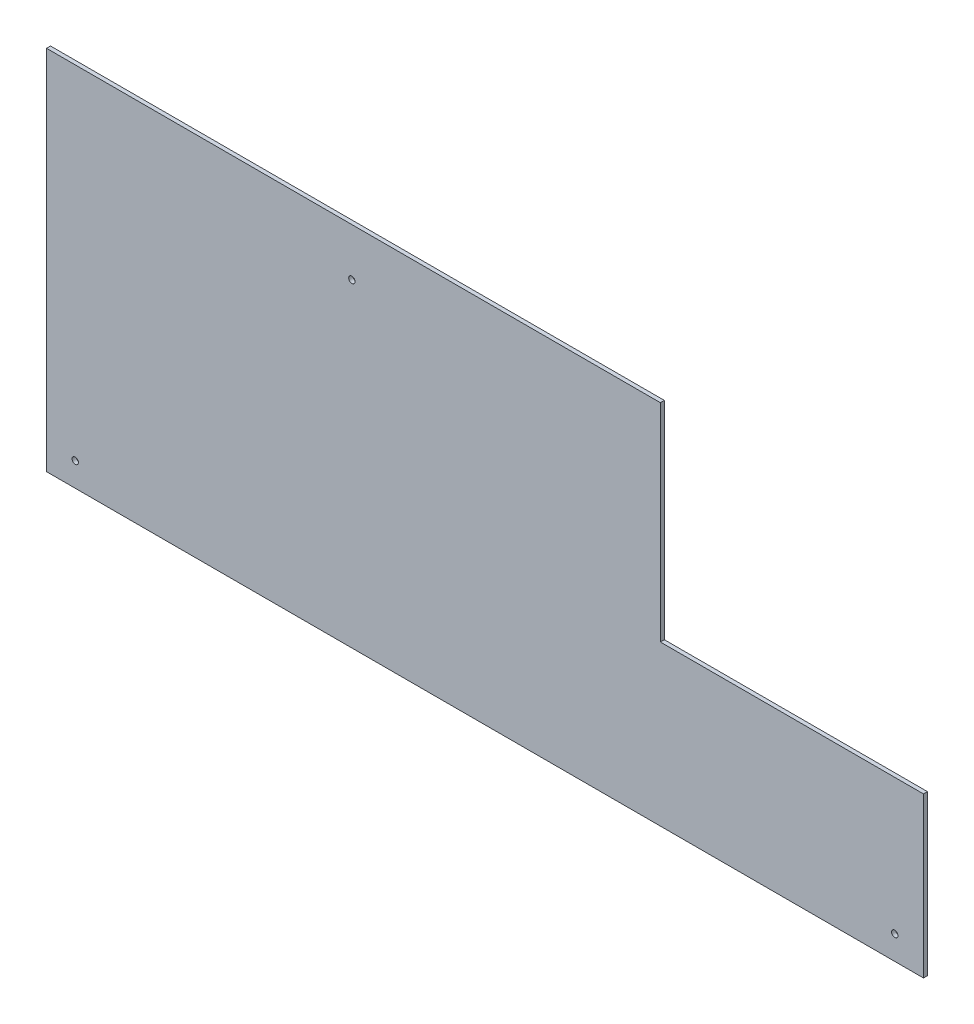
ISO-10303-21;
HEADER;
FILE_DESCRIPTION(('STEP AP214'),'2;1');
FILE_NAME('part.step','',(''),(''),'','','');
FILE_SCHEMA(('AUTOMOTIVE_DESIGN { 1 0 10303 214 1 1 1 1 }'));
ENDSEC;
DATA;
#1=APPLICATION_CONTEXT('core data for automotive mechanical design processes');
#2=APPLICATION_PROTOCOL_DEFINITION('international standard','automotive_design',2000,#1);
#3=PRODUCT_CONTEXT('',#1,'mechanical');
#4=PRODUCT('Part','Part','',(#3));
#5=PRODUCT_RELATED_PRODUCT_CATEGORY('part','',(#4));
#6=PRODUCT_DEFINITION_FORMATION('','',#4);
#7=PRODUCT_DEFINITION_CONTEXT('part definition',#1,'design');
#8=PRODUCT_DEFINITION('design','',#6,#7);
#9=PRODUCT_DEFINITION_SHAPE('','',#8);
#10=(LENGTH_UNIT() NAMED_UNIT(*) SI_UNIT(.MILLI.,.METRE.));
#11=(NAMED_UNIT(*) PLANE_ANGLE_UNIT() SI_UNIT($,.RADIAN.));
#12=(NAMED_UNIT(*) SI_UNIT($,.STERADIAN.) SOLID_ANGLE_UNIT());
#13=UNCERTAINTY_MEASURE_WITH_UNIT(LENGTH_MEASURE(1.E-05),#10,'distance_accuracy_value','');
#14=(GEOMETRIC_REPRESENTATION_CONTEXT(3) GLOBAL_UNCERTAINTY_ASSIGNED_CONTEXT((#13)) GLOBAL_UNIT_ASSIGNED_CONTEXT((#10,
#11,#12)) REPRESENTATION_CONTEXT('',''));
#15=CARTESIAN_POINT('',(0.,0.,0.));
#16=DIRECTION('',(0.,0.,1.));
#17=DIRECTION('',(1.,0.,0.));
#18=AXIS2_PLACEMENT_3D('',#15,#16,#17);
#19=CARTESIAN_POINT('',(275.,-115.,2.5));
#20=DIRECTION('',(-1.,0.,0.));
#21=DIRECTION('',(0.,0.,1.));
#22=AXIS2_PLACEMENT_3D('',#19,#20,#21);
#23=PLANE('',#22);
#24=DIRECTION('',(0.,1.,0.));
#25=VECTOR('',#24,1.);
#26=CARTESIAN_POINT('',(275.,-115.,0.));
#27=LINE('',#26,#25);
#28=CARTESIAN_POINT('',(275.,-115.,0.));
#29=VERTEX_POINT('',#28);
#30=CARTESIAN_POINT('',(275.,-15.,0.));
#31=VERTEX_POINT('',#30);
#32=EDGE_CURVE('E128',#29,#31,#27,.T.);
#33=ORIENTED_EDGE('',*,*,#32,.T.);
#34=DIRECTION('',(0.,0.,-1.));
#35=VECTOR('',#34,1.);
#36=CARTESIAN_POINT('',(275.,-15.,10.));
#37=LINE('',#36,#35);
#38=CARTESIAN_POINT('',(275.,-15.,2.5));
#39=VERTEX_POINT('',#38);
#40=EDGE_CURVE('E53',#39,#31,#37,.T.);
#41=ORIENTED_EDGE('',*,*,#40,.F.);
#42=DIRECTION('',(0.,1.,0.));
#43=VECTOR('',#42,1.);
#44=CARTESIAN_POINT('',(275.,-115.,2.5));
#45=LINE('',#44,#43);
#46=CARTESIAN_POINT('',(275.,-115.,2.5));
#47=VERTEX_POINT('',#46);
#48=EDGE_CURVE('E129',#47,#39,#45,.T.);
#49=ORIENTED_EDGE('',*,*,#48,.F.);
#50=DIRECTION('',(0.,0.,-1.));
#51=VECTOR('',#50,1.);
#52=CARTESIAN_POINT('',(275.,-115.,2.5));
#53=LINE('',#52,#51);
#54=EDGE_CURVE('E135',#47,#29,#53,.T.);
#55=ORIENTED_EDGE('',*,*,#54,.T.);
#56=EDGE_LOOP('',(#33,#41,#49,#55));
#57=FACE_BOUND('',#56,.T.);
#58=ADVANCED_FACE('F37',(#57),#23,.F.);
#59=CARTESIAN_POINT('',(275.,115.,2.5));
#60=DIRECTION('',(0.,-1.,0.));
#61=DIRECTION('',(1.,0.,0.));
#62=AXIS2_PLACEMENT_3D('',#59,#60,#61);
#63=PLANE('',#62);
#64=DIRECTION('',(-1.,0.,0.));
#65=VECTOR('',#64,1.);
#66=CARTESIAN_POINT('',(275.,115.,2.5));
#67=LINE('',#66,#65);
#68=CARTESIAN_POINT('',(110.,115.,2.5));
#69=VERTEX_POINT('',#68);
#70=CARTESIAN_POINT('',(-275.,115.,2.5));
#71=VERTEX_POINT('',#70);
#72=EDGE_CURVE('E84',#69,#71,#67,.T.);
#73=ORIENTED_EDGE('',*,*,#72,.F.);
#74=DIRECTION('',(0.,0.,-1.));
#75=VECTOR('',#74,1.);
#76=CARTESIAN_POINT('',(110.,115.,10.));
#77=LINE('',#76,#75);
#78=CARTESIAN_POINT('',(110.,115.,0.));
#79=VERTEX_POINT('',#78);
#80=EDGE_CURVE('E108',#69,#79,#77,.T.);
#81=ORIENTED_EDGE('',*,*,#80,.T.);
#82=DIRECTION('',(-1.,0.,0.));
#83=VECTOR('',#82,1.);
#84=CARTESIAN_POINT('',(275.,115.,0.));
#85=LINE('',#84,#83);
#86=CARTESIAN_POINT('',(-275.,115.,0.));
#87=VERTEX_POINT('',#86);
#88=EDGE_CURVE('E119',#79,#87,#85,.T.);
#89=ORIENTED_EDGE('',*,*,#88,.T.);
#90=DIRECTION('',(0.,0.,-1.));
#91=VECTOR('',#90,1.);
#92=CARTESIAN_POINT('',(-275.,115.,2.5));
#93=LINE('',#92,#91);
#94=EDGE_CURVE('E11',#71,#87,#93,.T.);
#95=ORIENTED_EDGE('',*,*,#94,.F.);
#96=EDGE_LOOP('',(#73,#81,#89,#95));
#97=FACE_BOUND('',#96,.T.);
#98=ADVANCED_FACE('F167',(#97),#63,.F.);
#99=CARTESIAN_POINT('',(-275.,-115.,2.5));
#100=DIRECTION('',(1.,0.,0.));
#101=DIRECTION('',(0.,0.,-1.));
#102=AXIS2_PLACEMENT_3D('',#99,#100,#101);
#103=PLANE('',#102);
#104=DIRECTION('',(0.,-1.,0.));
#105=VECTOR('',#104,1.);
#106=CARTESIAN_POINT('',(-275.,-115.,0.));
#107=LINE('',#106,#105);
#108=CARTESIAN_POINT('',(-275.,-115.,0.));
#109=VERTEX_POINT('',#108);
#110=EDGE_CURVE('E138',#87,#109,#107,.T.);
#111=ORIENTED_EDGE('',*,*,#110,.T.);
#112=DIRECTION('',(0.,0.,-1.));
#113=VECTOR('',#112,1.);
#114=CARTESIAN_POINT('',(-275.,-115.,2.5));
#115=LINE('',#114,#113);
#116=CARTESIAN_POINT('',(-275.,-115.,2.5));
#117=VERTEX_POINT('',#116);
#118=EDGE_CURVE('E45',#117,#109,#115,.T.);
#119=ORIENTED_EDGE('',*,*,#118,.F.);
#120=DIRECTION('',(0.,-1.,0.));
#121=VECTOR('',#120,1.);
#122=CARTESIAN_POINT('',(-275.,-115.,2.5));
#123=LINE('',#122,#121);
#124=EDGE_CURVE('E132',#71,#117,#123,.T.);
#125=ORIENTED_EDGE('',*,*,#124,.F.);
#126=ORIENTED_EDGE('',*,*,#94,.T.);
#127=EDGE_LOOP('',(#111,#119,#125,#126));
#128=FACE_BOUND('',#127,.T.);
#129=ADVANCED_FACE('F172',(#128),#103,.F.);
#130=CARTESIAN_POINT('',(275.,-115.,2.5));
#131=DIRECTION('',(0.,1.,0.));
#132=DIRECTION('',(-1.,0.,0.));
#133=AXIS2_PLACEMENT_3D('',#130,#131,#132);
#134=PLANE('',#133);
#135=DIRECTION('',(1.,0.,0.));
#136=VECTOR('',#135,1.);
#137=CARTESIAN_POINT('',(275.,-115.,0.));
#138=LINE('',#137,#136);
#139=EDGE_CURVE('E79',#109,#29,#138,.T.);
#140=ORIENTED_EDGE('',*,*,#139,.T.);
#141=ORIENTED_EDGE('',*,*,#54,.F.);
#142=DIRECTION('',(1.,0.,0.));
#143=VECTOR('',#142,1.);
#144=CARTESIAN_POINT('',(275.,-115.,2.5));
#145=LINE('',#144,#143);
#146=EDGE_CURVE('E62',#117,#47,#145,.T.);
#147=ORIENTED_EDGE('',*,*,#146,.F.);
#148=ORIENTED_EDGE('',*,*,#118,.T.);
#149=EDGE_LOOP('',(#140,#141,#147,#148));
#150=FACE_BOUND('',#149,.T.);
#151=ADVANCED_FACE('F178',(#150),#134,.F.);
#152=CARTESIAN_POINT('',(0.,0.,2.5));
#153=DIRECTION('',(0.,0.,1.));
#154=DIRECTION('',(1.,0.,0.));
#155=AXIS2_PLACEMENT_3D('',#152,#153,#154);
#156=PLANE('',#155);
#157=CARTESIAN_POINT('',(-83.5000000000001,84.9999999999999,2.5));
#158=DIRECTION('',(0.,0.,1.));
#159=DIRECTION('',(1.,0.,0.));
#160=AXIS2_PLACEMENT_3D('',#157,#158,#159);
#161=CIRCLE('',#160,2.);
#162=CARTESIAN_POINT('',(-81.5000000000001,84.9999999999999,2.5));
#163=VERTEX_POINT('',#162);
#164=EDGE_CURVE('E146',#163,#163,#161,.T.);
#165=ORIENTED_EDGE('',*,*,#164,.F.);
#166=EDGE_LOOP('',(#165));
#167=FACE_BOUND('',#166,.T.);
#168=CARTESIAN_POINT('',(-257.,-99.9999999999979,2.5));
#169=DIRECTION('',(0.,0.,1.));
#170=DIRECTION('',(1.,0.,0.));
#171=AXIS2_PLACEMENT_3D('',#168,#169,#170);
#172=CIRCLE('',#171,2.);
#173=CARTESIAN_POINT('',(-255.,-99.9999999999979,2.5));
#174=VERTEX_POINT('',#173);
#175=EDGE_CURVE('E289',#174,#174,#172,.T.);
#176=ORIENTED_EDGE('',*,*,#175,.F.);
#177=EDGE_LOOP('',(#176));
#178=FACE_BOUND('',#177,.T.);
#179=CARTESIAN_POINT('',(257.,-99.9999999999979,2.5));
#180=DIRECTION('',(0.,0.,1.));
#181=DIRECTION('',(1.,0.,0.));
#182=AXIS2_PLACEMENT_3D('',#179,#180,#181);
#183=CIRCLE('',#182,2.);
#184=CARTESIAN_POINT('',(259.,-99.9999999999979,2.5));
#185=VERTEX_POINT('',#184);
#186=EDGE_CURVE('E285',#185,#185,#183,.T.);
#187=ORIENTED_EDGE('',*,*,#186,.F.);
#188=EDGE_LOOP('',(#187));
#189=FACE_BOUND('',#188,.T.);
#190=DIRECTION('',(0.,-1.,0.));
#191=VECTOR('',#190,1.);
#192=CARTESIAN_POINT('',(110.,0.,2.5));
#193=LINE('',#192,#191);
#194=CARTESIAN_POINT('',(110.,-15.,2.5));
#195=VERTEX_POINT('',#194);
#196=EDGE_CURVE('E106',#69,#195,#193,.T.);
#197=ORIENTED_EDGE('',*,*,#196,.F.);
#198=ORIENTED_EDGE('',*,*,#72,.T.);
#199=ORIENTED_EDGE('',*,*,#124,.T.);
#200=ORIENTED_EDGE('',*,*,#146,.T.);
#201=ORIENTED_EDGE('',*,*,#48,.T.);
#202=DIRECTION('',(1.,0.,0.));
#203=VECTOR('',#202,1.);
#204=CARTESIAN_POINT('',(0.,-15.,2.5));
#205=LINE('',#204,#203);
#206=EDGE_CURVE('E124',#195,#39,#205,.T.);
#207=ORIENTED_EDGE('',*,*,#206,.F.);
#208=EDGE_LOOP('',(#197,#198,#199,#200,#201,#207));
#209=FACE_BOUND('',#208,.T.);
#210=ADVANCED_FACE('F179',(#167,#178,#189,#209),#156,.T.);
#211=CARTESIAN_POINT('',(0.,0.,0.));
#212=DIRECTION('',(0.,0.,1.));
#213=DIRECTION('',(1.,0.,0.));
#214=AXIS2_PLACEMENT_3D('',#211,#212,#213);
#215=PLANE('',#214);
#216=CARTESIAN_POINT('',(-83.5000000000001,84.9999999999999,0.));
#217=DIRECTION('',(0.,0.,1.));
#218=DIRECTION('',(1.,0.,0.));
#219=AXIS2_PLACEMENT_3D('',#216,#217,#218);
#220=CIRCLE('',#219,2.);
#221=CARTESIAN_POINT('',(-81.5000000000001,84.9999999999999,0.));
#222=VERTEX_POINT('',#221);
#223=EDGE_CURVE('E40',#222,#222,#220,.T.);
#224=ORIENTED_EDGE('',*,*,#223,.T.);
#225=EDGE_LOOP('',(#224));
#226=FACE_BOUND('',#225,.T.);
#227=CARTESIAN_POINT('',(-257.,-99.9999999999979,0.));
#228=DIRECTION('',(0.,0.,1.));
#229=DIRECTION('',(1.,0.,0.));
#230=AXIS2_PLACEMENT_3D('',#227,#228,#229);
#231=CIRCLE('',#230,2.);
#232=CARTESIAN_POINT('',(-255.,-99.9999999999979,0.));
#233=VERTEX_POINT('',#232);
#234=EDGE_CURVE('E145',#233,#233,#231,.T.);
#235=ORIENTED_EDGE('',*,*,#234,.T.);
#236=EDGE_LOOP('',(#235));
#237=FACE_BOUND('',#236,.T.);
#238=CARTESIAN_POINT('',(257.,-99.9999999999979,0.));
#239=DIRECTION('',(0.,0.,1.));
#240=DIRECTION('',(1.,0.,0.));
#241=AXIS2_PLACEMENT_3D('',#238,#239,#240);
#242=CIRCLE('',#241,2.);
#243=CARTESIAN_POINT('',(259.,-99.9999999999979,0.));
#244=VERTEX_POINT('',#243);
#245=EDGE_CURVE('E143',#244,#244,#242,.T.);
#246=ORIENTED_EDGE('',*,*,#245,.T.);
#247=EDGE_LOOP('',(#246));
#248=FACE_BOUND('',#247,.T.);
#249=ORIENTED_EDGE('',*,*,#88,.F.);
#250=DIRECTION('',(0.,1.,0.));
#251=VECTOR('',#250,1.);
#252=CARTESIAN_POINT('',(110.,115.,0.));
#253=LINE('',#252,#251);
#254=CARTESIAN_POINT('',(110.,-15.,0.));
#255=VERTEX_POINT('',#254);
#256=EDGE_CURVE('E104',#255,#79,#253,.T.);
#257=ORIENTED_EDGE('',*,*,#256,.F.);
#258=DIRECTION('',(-1.,0.,0.));
#259=VECTOR('',#258,1.);
#260=CARTESIAN_POINT('',(275.,-15.,0.));
#261=LINE('',#260,#259);
#262=EDGE_CURVE('E110',#31,#255,#261,.T.);
#263=ORIENTED_EDGE('',*,*,#262,.F.);
#264=ORIENTED_EDGE('',*,*,#32,.F.);
#265=ORIENTED_EDGE('',*,*,#139,.F.);
#266=ORIENTED_EDGE('',*,*,#110,.F.);
#267=EDGE_LOOP('',(#249,#257,#263,#264,#265,#266));
#268=FACE_BOUND('',#267,.T.);
#269=ADVANCED_FACE('F117',(#226,#237,#248,#268),#215,.F.);
#270=CARTESIAN_POINT('',(110.,115.,10.));
#271=DIRECTION('',(-1.,0.,0.));
#272=DIRECTION('',(0.,-1.,0.));
#273=AXIS2_PLACEMENT_3D('',#270,#271,#272);
#274=PLANE('',#273);
#275=ORIENTED_EDGE('',*,*,#196,.T.);
#276=DIRECTION('',(0.,0.,-1.));
#277=VECTOR('',#276,1.);
#278=CARTESIAN_POINT('',(110.,-15.,10.));
#279=LINE('',#278,#277);
#280=EDGE_CURVE('E101',#195,#255,#279,.T.);
#281=ORIENTED_EDGE('',*,*,#280,.T.);
#282=ORIENTED_EDGE('',*,*,#256,.T.);
#283=ORIENTED_EDGE('',*,*,#80,.F.);
#284=EDGE_LOOP('',(#275,#281,#282,#283));
#285=FACE_BOUND('',#284,.T.);
#286=ADVANCED_FACE('F102',(#285),#274,.F.);
#287=CARTESIAN_POINT('',(275.,-15.,10.));
#288=DIRECTION('',(0.,-1.,0.));
#289=DIRECTION('',(0.,0.,-1.));
#290=AXIS2_PLACEMENT_3D('',#287,#288,#289);
#291=PLANE('',#290);
#292=ORIENTED_EDGE('',*,*,#206,.T.);
#293=ORIENTED_EDGE('',*,*,#40,.T.);
#294=ORIENTED_EDGE('',*,*,#262,.T.);
#295=ORIENTED_EDGE('',*,*,#280,.F.);
#296=EDGE_LOOP('',(#292,#293,#294,#295));
#297=FACE_BOUND('',#296,.T.);
#298=ADVANCED_FACE('F111',(#297),#291,.F.);
#299=CARTESIAN_POINT('',(257.,-99.9999999999979,-7.5));
#300=DIRECTION('',(0.,0.,1.));
#301=DIRECTION('',(1.,0.,0.));
#302=AXIS2_PLACEMENT_3D('',#299,#300,#301);
#303=CYLINDRICAL_SURFACE('',#302,2.);
#304=ORIENTED_EDGE('',*,*,#186,.T.);
#305=EDGE_LOOP('',(#304));
#306=FACE_BOUND('',#305,.T.);
#307=ORIENTED_EDGE('',*,*,#245,.F.);
#308=EDGE_LOOP('',(#307));
#309=FACE_BOUND('',#308,.T.);
#310=ADVANCED_FACE('F162',(#306,#309),#303,.F.);
#311=CARTESIAN_POINT('',(-257.,-99.9999999999979,-7.5));
#312=DIRECTION('',(0.,0.,1.));
#313=DIRECTION('',(1.,0.,0.));
#314=AXIS2_PLACEMENT_3D('',#311,#312,#313);
#315=CYLINDRICAL_SURFACE('',#314,2.);
#316=ORIENTED_EDGE('',*,*,#175,.T.);
#317=EDGE_LOOP('',(#316));
#318=FACE_BOUND('',#317,.T.);
#319=ORIENTED_EDGE('',*,*,#234,.F.);
#320=EDGE_LOOP('',(#319));
#321=FACE_BOUND('',#320,.T.);
#322=ADVANCED_FACE('F156',(#318,#321),#315,.F.);
#323=CARTESIAN_POINT('',(-83.5000000000001,84.9999999999999,-7.5));
#324=DIRECTION('',(0.,0.,1.));
#325=DIRECTION('',(1.,0.,0.));
#326=AXIS2_PLACEMENT_3D('',#323,#324,#325);
#327=CYLINDRICAL_SURFACE('',#326,2.);
#328=ORIENTED_EDGE('',*,*,#164,.T.);
#329=EDGE_LOOP('',(#328));
#330=FACE_BOUND('',#329,.T.);
#331=ORIENTED_EDGE('',*,*,#223,.F.);
#332=EDGE_LOOP('',(#331));
#333=FACE_BOUND('',#332,.T.);
#334=ADVANCED_FACE('F154',(#330,#333),#327,.F.);
#335=CLOSED_SHELL('',(#58,#98,#129,#151,#210,#269,#286,#298,#310,#322,#334));
#336=MANIFOLD_SOLID_BREP('B2',#335);
#337=ADVANCED_BREP_SHAPE_REPRESENTATION('',(#18,#336),#14);
#338=SHAPE_DEFINITION_REPRESENTATION(#9,#337);
ENDSEC;
END-ISO-10303-21;
